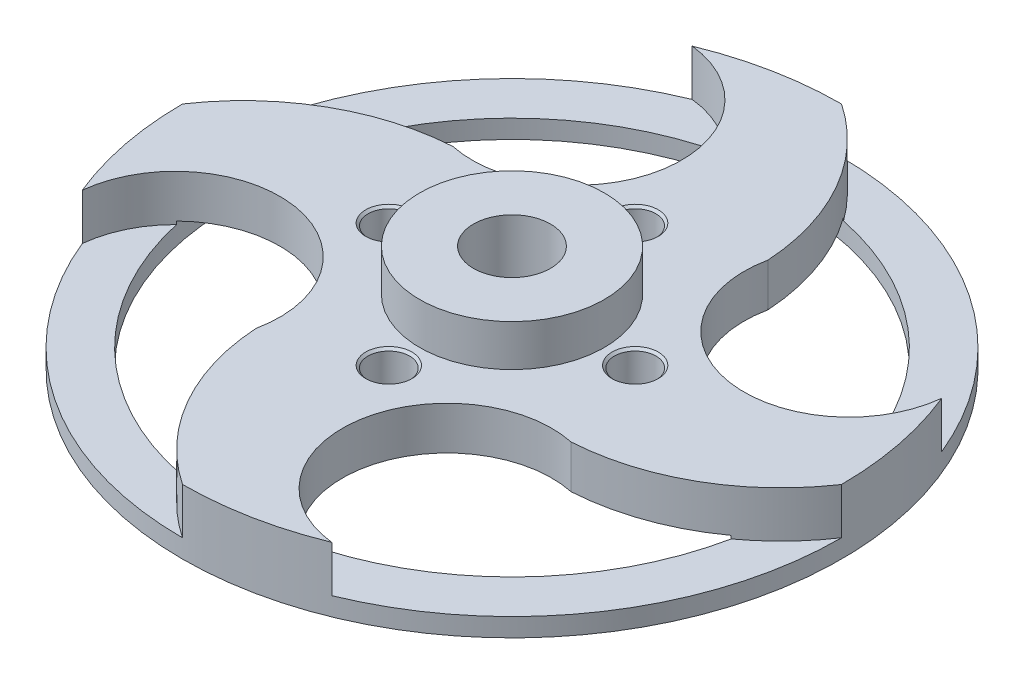
ISO-10303-21;
HEADER;
FILE_DESCRIPTION(('STEP AP214'),'2;1');
FILE_NAME('part.step','',(''),(''),'','','');
FILE_SCHEMA(('AUTOMOTIVE_DESIGN { 1 0 10303 214 1 1 1 1 }'));
ENDSEC;
DATA;
#1=APPLICATION_CONTEXT('core data for automotive mechanical design processes');
#2=APPLICATION_PROTOCOL_DEFINITION('international standard','automotive_design',2000,#1);
#3=PRODUCT_CONTEXT('',#1,'mechanical');
#4=PRODUCT('Part','Part','',(#3));
#5=PRODUCT_RELATED_PRODUCT_CATEGORY('part','',(#4));
#6=PRODUCT_DEFINITION_FORMATION('','',#4);
#7=PRODUCT_DEFINITION_CONTEXT('part definition',#1,'design');
#8=PRODUCT_DEFINITION('design','',#6,#7);
#9=PRODUCT_DEFINITION_SHAPE('','',#8);
#10=(LENGTH_UNIT() NAMED_UNIT(*) SI_UNIT(.MILLI.,.METRE.));
#11=(NAMED_UNIT(*) PLANE_ANGLE_UNIT() SI_UNIT($,.RADIAN.));
#12=(NAMED_UNIT(*) SI_UNIT($,.STERADIAN.) SOLID_ANGLE_UNIT());
#13=UNCERTAINTY_MEASURE_WITH_UNIT(LENGTH_MEASURE(1.E-05),#10,'distance_accuracy_value','');
#14=(GEOMETRIC_REPRESENTATION_CONTEXT(3) GLOBAL_UNCERTAINTY_ASSIGNED_CONTEXT((#13)) GLOBAL_UNIT_ASSIGNED_CONTEXT((#10,
#11,#12)) REPRESENTATION_CONTEXT('',''));
#15=CARTESIAN_POINT('',(0.,0.,0.));
#16=DIRECTION('',(0.,0.,1.));
#17=DIRECTION('',(1.,0.,0.));
#18=AXIS2_PLACEMENT_3D('',#15,#16,#17);
#19=CARTESIAN_POINT('',(-4.674678694587,4.2,4.05228917172682));
#20=DIRECTION('',(0.,1.,0.));
#21=DIRECTION('',(0.,0.,1.));
#22=AXIS2_PLACEMENT_3D('',#19,#20,#21);
#23=PLANE('',#22);
#24=CARTESIAN_POINT('',(-7.99999999999977,4.2,2.27373675443232E-13));
#25=DIRECTION('',(0.,1.,0.));
#26=DIRECTION('',(0.,0.,1.));
#27=AXIS2_PLACEMENT_3D('',#24,#25,#26);
#28=CIRCLE('',#27,1.5);
#29=CARTESIAN_POINT('',(-7.99999999999977,4.2,1.50000000000023));
#30=VERTEX_POINT('',#29);
#31=EDGE_CURVE('E701',#30,#30,#28,.T.);
#32=ORIENTED_EDGE('',*,*,#31,.F.);
#33=EDGE_LOOP('',(#32));
#34=FACE_BOUND('',#33,.T.);
#35=CARTESIAN_POINT('',(0.,4.2,-8.));
#36=DIRECTION('',(0.,1.,0.));
#37=DIRECTION('',(0.,0.,1.));
#38=AXIS2_PLACEMENT_3D('',#35,#36,#37);
#39=CIRCLE('',#38,1.5);
#40=CARTESIAN_POINT('',(0.,4.2,-6.5));
#41=VERTEX_POINT('',#40);
#42=EDGE_CURVE('E325',#41,#41,#39,.T.);
#43=ORIENTED_EDGE('',*,*,#42,.F.);
#44=EDGE_LOOP('',(#43));
#45=FACE_BOUND('',#44,.T.);
#46=CARTESIAN_POINT('',(8.00000000000023,4.2,-2.26393958003914E-13));
#47=DIRECTION('',(0.,1.,0.));
#48=DIRECTION('',(0.,0.,1.));
#49=AXIS2_PLACEMENT_3D('',#46,#47,#48);
#50=CIRCLE('',#49,1.5);
#51=CARTESIAN_POINT('',(8.00000000000023,4.2,1.49999999999977));
#52=VERTEX_POINT('',#51);
#53=EDGE_CURVE('E318',#52,#52,#50,.T.);
#54=ORIENTED_EDGE('',*,*,#53,.F.);
#55=EDGE_LOOP('',(#54));
#56=FACE_BOUND('',#55,.T.);
#57=CARTESIAN_POINT('',(4.52787916007828E-13,4.2,8.));
#58=DIRECTION('',(0.,1.,0.));
#59=DIRECTION('',(0.,0.,1.));
#60=AXIS2_PLACEMENT_3D('',#57,#58,#59);
#61=CIRCLE('',#60,1.5);
#62=CARTESIAN_POINT('',(4.52787916007828E-13,4.2,9.5));
#63=VERTEX_POINT('',#62);
#64=EDGE_CURVE('E314',#63,#63,#61,.T.);
#65=ORIENTED_EDGE('',*,*,#64,.F.);
#66=EDGE_LOOP('',(#65));
#67=FACE_BOUND('',#66,.T.);
#68=CARTESIAN_POINT('',(-9.34935738917399,4.2,8.10457834345364));
#69=DIRECTION('',(0.,1.,0.));
#70=DIRECTION('',(0.,0.,1.));
#71=AXIS2_PLACEMENT_3D('',#68,#69,#70);
#72=CIRCLE('',#71,14.5224714652511);
#73=CARTESIAN_POINT('',(-10.2293630007753,4.2,-6.39120613282027));
#74=VERTEX_POINT('',#73);
#75=CARTESIAN_POINT('',(-21.3999999999999,4.2,0.));
#76=VERTEX_POINT('',#75);
#77=EDGE_CURVE('E213',#74,#76,#72,.T.);
#78=ORIENTED_EDGE('',*,*,#77,.T.);
#79=CARTESIAN_POINT('',(0.,4.2,0.));
#80=DIRECTION('',(0.,1.,0.));
#81=DIRECTION('',(0.,0.,1.));
#82=AXIS2_PLACEMENT_3D('',#79,#80,#81);
#83=CIRCLE('',#82,21.3999999999999);
#84=CARTESIAN_POINT('',(-19.8066651088152,4.2,8.10284007414914));
#85=VERTEX_POINT('',#84);
#86=EDGE_CURVE('E216',#76,#85,#83,.T.);
#87=ORIENTED_EDGE('',*,*,#86,.T.);
#88=CARTESIAN_POINT('',(-13.0456505625838,4.2,8.82994550367591));
#89=DIRECTION('',(0.,1.,0.));
#90=DIRECTION('',(0.,0.,1.));
#91=AXIS2_PLACEMENT_3D('',#88,#89,#90);
#92=CIRCLE('',#91,6.8);
#93=CARTESIAN_POINT('',(-6.39120613282025,4.2,10.2293630007753));
#94=VERTEX_POINT('',#93);
#95=EDGE_CURVE('E218',#94,#85,#92,.T.);
#96=ORIENTED_EDGE('',*,*,#95,.F.);
#97=CARTESIAN_POINT('',(8.10457834345376,4.2,9.34935738917391));
#98=DIRECTION('',(0.,1.,0.));
#99=DIRECTION('',(0.,0.,1.));
#100=AXIS2_PLACEMENT_3D('',#97,#98,#99);
#101=CIRCLE('',#100,14.5224714652512);
#102=CARTESIAN_POINT('',(-1.52056145452661E-13,4.2,21.3999999999999));
#103=VERTEX_POINT('',#102);
#104=EDGE_CURVE('E221',#94,#103,#101,.T.);
#105=ORIENTED_EDGE('',*,*,#104,.T.);
#106=CARTESIAN_POINT('',(0.,4.2,0.));
#107=DIRECTION('',(0.,1.,0.));
#108=DIRECTION('',(0.,0.,1.));
#109=AXIS2_PLACEMENT_3D('',#106,#107,#108);
#110=CIRCLE('',#109,21.3999999999999);
#111=CARTESIAN_POINT('',(8.10284007414926,4.2,19.8066651088151));
#112=VERTEX_POINT('',#111);
#113=EDGE_CURVE('E223',#103,#112,#110,.T.);
#114=ORIENTED_EDGE('',*,*,#113,.T.);
#115=CARTESIAN_POINT('',(8.82994550367604,4.2,13.0456505625837));
#116=DIRECTION('',(0.,1.,0.));
#117=DIRECTION('',(0.,0.,1.));
#118=AXIS2_PLACEMENT_3D('',#115,#116,#117);
#119=CIRCLE('',#118,6.8);
#120=CARTESIAN_POINT('',(10.2293630007754,4.2,6.39120613282012));
#121=VERTEX_POINT('',#120);
#122=EDGE_CURVE('E225',#121,#112,#119,.T.);
#123=ORIENTED_EDGE('',*,*,#122,.F.);
#124=CARTESIAN_POINT('',(9.34935738917403,4.2,-8.10457834345385));
#125=DIRECTION('',(0.,1.,0.));
#126=DIRECTION('',(0.,0.,1.));
#127=AXIS2_PLACEMENT_3D('',#124,#125,#126);
#128=CIRCLE('',#127,14.5224714652512);
#129=CARTESIAN_POINT('',(21.4,4.2,0.));
#130=VERTEX_POINT('',#129);
#131=EDGE_CURVE('E228',#121,#130,#128,.T.);
#132=ORIENTED_EDGE('',*,*,#131,.T.);
#133=CARTESIAN_POINT('',(0.,4.2,0.));
#134=DIRECTION('',(0.,1.,0.));
#135=DIRECTION('',(0.,0.,1.));
#136=AXIS2_PLACEMENT_3D('',#133,#134,#135);
#137=CIRCLE('',#136,21.4);
#138=CARTESIAN_POINT('',(19.8066651088152,4.2,-8.10284007414934));
#139=VERTEX_POINT('',#138);
#140=EDGE_CURVE('E230',#130,#139,#137,.T.);
#141=ORIENTED_EDGE('',*,*,#140,.T.);
#142=CARTESIAN_POINT('',(13.0456505625838,4.2,-8.82994550367612));
#143=DIRECTION('',(0.,1.,0.));
#144=DIRECTION('',(0.,0.,1.));
#145=AXIS2_PLACEMENT_3D('',#142,#143,#144);
#146=CIRCLE('',#145,6.8);
#147=CARTESIAN_POINT('',(6.39120613282015,4.2,-10.2293630007755));
#148=VERTEX_POINT('',#147);
#149=EDGE_CURVE('E232',#148,#139,#146,.T.);
#150=ORIENTED_EDGE('',*,*,#149,.F.);
#151=CARTESIAN_POINT('',(-8.10457834345372,4.2,-9.34935738917412));
#152=DIRECTION('',(0.,1.,0.));
#153=DIRECTION('',(0.,0.,1.));
#154=AXIS2_PLACEMENT_3D('',#151,#152,#153);
#155=CIRCLE('',#154,14.5224714652511);
#156=CARTESIAN_POINT('',(0.,4.2,-21.4));
#157=VERTEX_POINT('',#156);
#158=EDGE_CURVE('E235',#148,#157,#155,.T.);
#159=ORIENTED_EDGE('',*,*,#158,.T.);
#160=CARTESIAN_POINT('',(0.,4.2,0.));
#161=DIRECTION('',(0.,1.,0.));
#162=DIRECTION('',(0.,0.,1.));
#163=AXIS2_PLACEMENT_3D('',#160,#161,#162);
#164=CIRCLE('',#163,21.4);
#165=CARTESIAN_POINT('',(-8.10284007414922,4.2,-19.8066651088153));
#166=VERTEX_POINT('',#165);
#167=EDGE_CURVE('E237',#157,#166,#164,.T.);
#168=ORIENTED_EDGE('',*,*,#167,.T.);
#169=CARTESIAN_POINT('',(-8.829945503676,4.2,-13.0456505625839));
#170=DIRECTION('',(0.,1.,0.));
#171=DIRECTION('',(0.,0.,1.));
#172=AXIS2_PLACEMENT_3D('',#169,#170,#171);
#173=CIRCLE('',#172,6.8);
#174=EDGE_CURVE('E239',#74,#166,#173,.T.);
#175=ORIENTED_EDGE('',*,*,#174,.F.);
#176=EDGE_LOOP('',(#78,#87,#96,#105,#114,#123,#132,#141,#150,#159,#168,#175));
#177=FACE_BOUND('',#176,.T.);
#178=CARTESIAN_POINT('',(0.,4.2,0.));
#179=DIRECTION('',(0.,1.,0.));
#180=DIRECTION('',(0.,0.,1.));
#181=AXIS2_PLACEMENT_3D('',#178,#179,#180);
#182=CIRCLE('',#181,6.);
#183=CARTESIAN_POINT('',(0.,4.2,-6.));
#184=VERTEX_POINT('',#183);
#185=EDGE_CURVE('E344',#184,#184,#182,.T.);
#186=ORIENTED_EDGE('',*,*,#185,.F.);
#187=EDGE_LOOP('',(#186));
#188=FACE_BOUND('',#187,.T.);
#189=ADVANCED_FACE('F35',(#34,#45,#56,#67,#177,#188),#23,.T.);
#190=CARTESIAN_POINT('',(0.,1.2,0.));
#191=DIRECTION('',(0.,1.,0.));
#192=DIRECTION('',(0.,0.,1.));
#193=AXIS2_PLACEMENT_3D('',#190,#191,#192);
#194=PLANE('',#193);
#195=CARTESIAN_POINT('',(0.,1.2,0.));
#196=DIRECTION('',(0.,1.,0.));
#197=DIRECTION('',(0.,0.,1.));
#198=AXIS2_PLACEMENT_3D('',#195,#196,#197);
#199=CIRCLE('',#198,18.25);
#200=CARTESIAN_POINT('',(-17.8109574433167,1.2,3.97898164765316));
#201=VERTEX_POINT('',#200);
#202=CARTESIAN_POINT('',(-3.64692600239005,1.2,17.8819023242241));
#203=VERTEX_POINT('',#202);
#204=EDGE_CURVE('E209',#201,#203,#199,.T.);
#205=ORIENTED_EDGE('',*,*,#204,.F.);
#206=CARTESIAN_POINT('',(-13.0456505625838,1.2,8.82994550367591));
#207=DIRECTION('',(0.,1.,0.));
#208=DIRECTION('',(0.,0.,1.));
#209=AXIS2_PLACEMENT_3D('',#206,#207,#208);
#210=CIRCLE('',#209,6.8);
#211=CARTESIAN_POINT('',(-19.8066651088152,1.2,8.10284007414943));
#212=VERTEX_POINT('',#211);
#213=EDGE_CURVE('E292',#212,#201,#210,.F.);
#214=ORIENTED_EDGE('',*,*,#213,.F.);
#215=CARTESIAN_POINT('',(0.,1.2,0.));
#216=DIRECTION('',(0.,1.,0.));
#217=DIRECTION('',(0.,0.,1.));
#218=AXIS2_PLACEMENT_3D('',#215,#216,#217);
#219=CIRCLE('',#218,21.4);
#220=CARTESIAN_POINT('',(0.,1.2,21.4));
#221=VERTEX_POINT('',#220);
#222=EDGE_CURVE('E299',#212,#221,#219,.T.);
#223=ORIENTED_EDGE('',*,*,#222,.T.);
#224=CARTESIAN_POINT('',(8.10457834345376,1.2,9.34935738917391));
#225=DIRECTION('',(0.,1.,0.));
#226=DIRECTION('',(0.,0.,1.));
#227=AXIS2_PLACEMENT_3D('',#224,#225,#226);
#228=CIRCLE('',#227,14.5224714652512);
#229=EDGE_CURVE('E289',#221,#203,#228,.F.);
#230=ORIENTED_EDGE('',*,*,#229,.T.);
#231=EDGE_LOOP('',(#205,#214,#223,#230));
#232=FACE_BOUND('',#231,.T.);
#233=ADVANCED_FACE('F428',(#232),#194,.T.);
#234=CARTESIAN_POINT('',(0.,1.2,0.));
#235=DIRECTION('',(0.,1.,0.));
#236=DIRECTION('',(0.,0.,1.));
#237=AXIS2_PLACEMENT_3D('',#234,#235,#236);
#238=CIRCLE('',#237,18.25);
#239=CARTESIAN_POINT('',(3.97898164765333,1.2,17.8109574433167));
#240=VERTEX_POINT('',#239);
#241=CARTESIAN_POINT('',(17.8819023242241,1.2,3.64692600238998));
#242=VERTEX_POINT('',#241);
#243=EDGE_CURVE('E197',#240,#242,#238,.T.);
#244=ORIENTED_EDGE('',*,*,#243,.F.);
#245=CARTESIAN_POINT('',(8.82994550367604,1.2,13.0456505625837));
#246=DIRECTION('',(0.,1.,0.));
#247=DIRECTION('',(0.,0.,1.));
#248=AXIS2_PLACEMENT_3D('',#245,#246,#247);
#249=CIRCLE('',#248,6.8);
#250=CARTESIAN_POINT('',(8.10284007414963,1.2,19.8066651088151));
#251=VERTEX_POINT('',#250);
#252=EDGE_CURVE('E286',#251,#240,#249,.F.);
#253=ORIENTED_EDGE('',*,*,#252,.F.);
#254=CARTESIAN_POINT('',(21.4,1.2,0.));
#255=VERTEX_POINT('',#254);
#256=EDGE_CURVE('E302',#251,#255,#219,.T.);
#257=ORIENTED_EDGE('',*,*,#256,.T.);
#258=CARTESIAN_POINT('',(9.34935738917403,1.2,-8.10457834345385));
#259=DIRECTION('',(0.,1.,0.));
#260=DIRECTION('',(0.,0.,1.));
#261=AXIS2_PLACEMENT_3D('',#258,#259,#260);
#262=CIRCLE('',#261,14.5224714652512);
#263=EDGE_CURVE('E283',#255,#242,#262,.F.);
#264=ORIENTED_EDGE('',*,*,#263,.T.);
#265=EDGE_LOOP('',(#244,#253,#257,#264));
#266=FACE_BOUND('',#265,.T.);
#267=ADVANCED_FACE('F415',(#266),#194,.T.);
#268=CARTESIAN_POINT('',(0.,1.2,0.));
#269=DIRECTION('',(0.,1.,0.));
#270=DIRECTION('',(0.,0.,1.));
#271=AXIS2_PLACEMENT_3D('',#268,#269,#270);
#272=CIRCLE('',#271,18.25);
#273=CARTESIAN_POINT('',(-3.97898164765312,1.2,-17.8109574433167));
#274=VERTEX_POINT('',#273);
#275=CARTESIAN_POINT('',(-17.8819023242241,1.2,-3.64692600239006));
#276=VERTEX_POINT('',#275);
#277=EDGE_CURVE('E365',#274,#276,#272,.T.);
#278=ORIENTED_EDGE('',*,*,#277,.F.);
#279=CARTESIAN_POINT('',(-8.829945503676,1.2,-13.0456505625839));
#280=DIRECTION('',(0.,1.,0.));
#281=DIRECTION('',(0.,0.,1.));
#282=AXIS2_PLACEMENT_3D('',#279,#280,#281);
#283=CIRCLE('',#282,6.8);
#284=CARTESIAN_POINT('',(-8.10284007414921,1.2,-19.8066651088153));
#285=VERTEX_POINT('',#284);
#286=EDGE_CURVE('E276',#285,#274,#283,.F.);
#287=ORIENTED_EDGE('',*,*,#286,.F.);
#288=CARTESIAN_POINT('',(-21.4,1.2,0.));
#289=VERTEX_POINT('',#288);
#290=EDGE_CURVE('E301',#285,#289,#219,.T.);
#291=ORIENTED_EDGE('',*,*,#290,.T.);
#292=CARTESIAN_POINT('',(-9.34935738917399,1.2,8.10457834345364));
#293=DIRECTION('',(0.,1.,0.));
#294=DIRECTION('',(0.,0.,1.));
#295=AXIS2_PLACEMENT_3D('',#292,#293,#294);
#296=CIRCLE('',#295,14.5224714652511);
#297=EDGE_CURVE('E295',#289,#276,#296,.F.);
#298=ORIENTED_EDGE('',*,*,#297,.T.);
#299=EDGE_LOOP('',(#278,#287,#291,#298));
#300=FACE_BOUND('',#299,.T.);
#301=ADVANCED_FACE('F386',(#300),#194,.T.);
#302=CARTESIAN_POINT('',(0.,1.2,0.));
#303=DIRECTION('',(0.,-1.,0.));
#304=DIRECTION('',(0.,0.,-1.));
#305=AXIS2_PLACEMENT_3D('',#302,#303,#304);
#306=CYLINDRICAL_SURFACE('',#305,21.4);
#307=CARTESIAN_POINT('',(0.,0.,0.));
#308=DIRECTION('',(0.,1.,0.));
#309=DIRECTION('',(0.,0.,1.));
#310=AXIS2_PLACEMENT_3D('',#307,#308,#309);
#311=CIRCLE('',#310,21.4);
#312=CARTESIAN_POINT('',(0.,0.,21.4));
#313=VERTEX_POINT('',#312);
#314=EDGE_CURVE('E298',#313,#313,#311,.T.);
#315=ORIENTED_EDGE('',*,*,#314,.T.);
#316=EDGE_LOOP('',(#315));
#317=FACE_BOUND('',#316,.T.);
#318=DIRECTION('',(0.,-1.,0.));
#319=VECTOR('',#318,1.);
#320=CARTESIAN_POINT('',(-21.3999999999999,4.2,0.));
#321=LINE('',#320,#319);
#322=EDGE_CURVE('E273',#76,#289,#321,.T.);
#323=ORIENTED_EDGE('',*,*,#322,.T.);
#324=ORIENTED_EDGE('',*,*,#290,.F.);
#325=DIRECTION('',(0.,-1.,0.));
#326=VECTOR('',#325,1.);
#327=CARTESIAN_POINT('',(-8.10284007414922,4.2,-19.8066651088153));
#328=LINE('',#327,#326);
#329=EDGE_CURVE('E245',#166,#285,#328,.T.);
#330=ORIENTED_EDGE('',*,*,#329,.F.);
#331=ORIENTED_EDGE('',*,*,#167,.F.);
#332=DIRECTION('',(0.,-1.,0.));
#333=VECTOR('',#332,1.);
#334=CARTESIAN_POINT('',(0.,4.2,-21.4));
#335=LINE('',#334,#333);
#336=CARTESIAN_POINT('',(0.,1.2,-21.4));
#337=VERTEX_POINT('',#336);
#338=EDGE_CURVE('E248',#157,#337,#335,.T.);
#339=ORIENTED_EDGE('',*,*,#338,.T.);
#340=CARTESIAN_POINT('',(19.8066651088152,1.2,-8.10284007414941));
#341=VERTEX_POINT('',#340);
#342=EDGE_CURVE('E379',#341,#337,#219,.T.);
#343=ORIENTED_EDGE('',*,*,#342,.F.);
#344=DIRECTION('',(0.,-1.,0.));
#345=VECTOR('',#344,1.);
#346=CARTESIAN_POINT('',(19.8066651088152,4.2,-8.10284007414934));
#347=LINE('',#346,#345);
#348=EDGE_CURVE('E253',#139,#341,#347,.T.);
#349=ORIENTED_EDGE('',*,*,#348,.F.);
#350=ORIENTED_EDGE('',*,*,#140,.F.);
#351=DIRECTION('',(0.,-1.,0.));
#352=VECTOR('',#351,1.);
#353=CARTESIAN_POINT('',(21.4,4.2,0.));
#354=LINE('',#353,#352);
#355=EDGE_CURVE('E255',#130,#255,#354,.T.);
#356=ORIENTED_EDGE('',*,*,#355,.T.);
#357=ORIENTED_EDGE('',*,*,#256,.F.);
#358=DIRECTION('',(0.,-1.,0.));
#359=VECTOR('',#358,1.);
#360=CARTESIAN_POINT('',(8.10284007414926,4.2,19.8066651088151));
#361=LINE('',#360,#359);
#362=EDGE_CURVE('E261',#112,#251,#361,.T.);
#363=ORIENTED_EDGE('',*,*,#362,.F.);
#364=ORIENTED_EDGE('',*,*,#113,.F.);
#365=DIRECTION('',(0.,-1.,0.));
#366=VECTOR('',#365,1.);
#367=CARTESIAN_POINT('',(-1.52056145452661E-13,4.2,21.3999999999999));
#368=LINE('',#367,#366);
#369=EDGE_CURVE('E264',#103,#221,#368,.T.);
#370=ORIENTED_EDGE('',*,*,#369,.T.);
#371=ORIENTED_EDGE('',*,*,#222,.F.);
#372=DIRECTION('',(0.,-1.,0.));
#373=VECTOR('',#372,1.);
#374=CARTESIAN_POINT('',(-19.8066651088152,4.2,8.10284007414914));
#375=LINE('',#374,#373);
#376=EDGE_CURVE('E270',#85,#212,#375,.T.);
#377=ORIENTED_EDGE('',*,*,#376,.F.);
#378=ORIENTED_EDGE('',*,*,#86,.F.);
#379=EDGE_LOOP('',(#323,#324,#330,#331,#339,#343,#349,#350,#356,#357,#363,#364,#370,#371,#377,#378));
#380=FACE_BOUND('',#379,.T.);
#381=ADVANCED_FACE('F37',(#317,#380),#306,.T.);
#382=CARTESIAN_POINT('',(0.,1.2,0.));
#383=DIRECTION('',(0.,1.,0.));
#384=DIRECTION('',(0.,0.,1.));
#385=AXIS2_PLACEMENT_3D('',#382,#383,#384);
#386=CIRCLE('',#385,18.25);
#387=CARTESIAN_POINT('',(17.8109574433167,1.2,-3.97898164765329));
#388=VERTEX_POINT('',#387);
#389=CARTESIAN_POINT('',(3.64692600239006,1.2,-17.8819023242241));
#390=VERTEX_POINT('',#389);
#391=EDGE_CURVE('E195',#388,#390,#386,.T.);
#392=ORIENTED_EDGE('',*,*,#391,.F.);
#393=CARTESIAN_POINT('',(13.0456505625838,1.2,-8.82994550367612));
#394=DIRECTION('',(0.,1.,0.));
#395=DIRECTION('',(0.,0.,1.));
#396=AXIS2_PLACEMENT_3D('',#393,#394,#395);
#397=CIRCLE('',#396,6.8);
#398=EDGE_CURVE('E194',#341,#388,#397,.F.);
#399=ORIENTED_EDGE('',*,*,#398,.F.);
#400=ORIENTED_EDGE('',*,*,#342,.T.);
#401=CARTESIAN_POINT('',(-8.10457834345372,1.2,-9.34935738917412));
#402=DIRECTION('',(0.,1.,0.));
#403=DIRECTION('',(0.,0.,1.));
#404=AXIS2_PLACEMENT_3D('',#401,#402,#403);
#405=CIRCLE('',#404,14.5224714652511);
#406=EDGE_CURVE('E279',#337,#390,#405,.F.);
#407=ORIENTED_EDGE('',*,*,#406,.T.);
#408=EDGE_LOOP('',(#392,#399,#400,#407));
#409=FACE_BOUND('',#408,.T.);
#410=ADVANCED_FACE('F377',(#409),#194,.T.);
#411=CARTESIAN_POINT('',(0.,0.,0.));
#412=DIRECTION('',(0.,1.,0.));
#413=DIRECTION('',(0.,0.,1.));
#414=AXIS2_PLACEMENT_3D('',#411,#412,#413);
#415=PLANE('',#414);
#416=CARTESIAN_POINT('',(0.,0.,0.));
#417=DIRECTION('',(0.,-1.,0.));
#418=DIRECTION('',(0.,0.,-1.));
#419=AXIS2_PLACEMENT_3D('',#416,#417,#418);
#420=CIRCLE('',#419,18.25);
#421=CARTESIAN_POINT('',(0.,0.,-18.25));
#422=VERTEX_POINT('',#421);
#423=EDGE_CURVE('E348',#422,#422,#420,.T.);
#424=ORIENTED_EDGE('',*,*,#423,.F.);
#425=EDGE_LOOP('',(#424));
#426=FACE_BOUND('',#425,.T.);
#427=ORIENTED_EDGE('',*,*,#314,.F.);
#428=EDGE_LOOP('',(#427));
#429=FACE_BOUND('',#428,.T.);
#430=ADVANCED_FACE('F634',(#426,#429),#415,.F.);
#431=CARTESIAN_POINT('',(-9.34935738917399,4.2,8.10457834345364));
#432=DIRECTION('',(0.,-1.,0.));
#433=DIRECTION('',(0.,0.,-1.));
#434=AXIS2_PLACEMENT_3D('',#431,#432,#433);
#435=CYLINDRICAL_SURFACE('',#434,14.5224714652511);
#436=CARTESIAN_POINT('',(-9.34935738917399,1.4,8.10457834345364));
#437=DIRECTION('',(0.,-1.,0.));
#438=DIRECTION('',(0.,0.,-1.));
#439=AXIS2_PLACEMENT_3D('',#436,#437,#438);
#440=CIRCLE('',#439,14.5224714652511);
#441=CARTESIAN_POINT('',(-17.8819023242241,1.4,-3.64692600239006));
#442=VERTEX_POINT('',#441);
#443=CARTESIAN_POINT('',(-10.2293630007753,1.4,-6.39120613282027));
#444=VERTEX_POINT('',#443);
#445=EDGE_CURVE('E188',#442,#444,#440,.T.);
#446=ORIENTED_EDGE('',*,*,#445,.F.);
#447=DIRECTION('',(0.,-1.,0.));
#448=VECTOR('',#447,1.);
#449=CARTESIAN_POINT('',(-17.8819023242241,0.7,-3.64692600239006));
#450=LINE('',#449,#448);
#451=EDGE_CURVE('E367',#442,#276,#450,.T.);
#452=ORIENTED_EDGE('',*,*,#451,.T.);
#453=ORIENTED_EDGE('',*,*,#297,.F.);
#454=ORIENTED_EDGE('',*,*,#322,.F.);
#455=ORIENTED_EDGE('',*,*,#77,.F.);
#456=DIRECTION('',(0.,-1.,0.));
#457=VECTOR('',#456,1.);
#458=CARTESIAN_POINT('',(-10.2293630007753,4.2,-6.39120613282027));
#459=LINE('',#458,#457);
#460=EDGE_CURVE('E242',#74,#444,#459,.T.);
#461=ORIENTED_EDGE('',*,*,#460,.T.);
#462=EDGE_LOOP('',(#446,#452,#453,#454,#455,#461));
#463=FACE_BOUND('',#462,.T.);
#464=ADVANCED_FACE('F391',(#463),#435,.T.);
#465=CARTESIAN_POINT('',(-13.0456505625838,4.2,8.82994550367591));
#466=DIRECTION('',(0.,-1.,0.));
#467=DIRECTION('',(0.,0.,-1.));
#468=AXIS2_PLACEMENT_3D('',#465,#466,#467);
#469=CYLINDRICAL_SURFACE('',#468,6.8);
#470=DIRECTION('',(0.,-1.,0.));
#471=VECTOR('',#470,1.);
#472=CARTESIAN_POINT('',(-17.8109574433167,0.7,3.97898164765316));
#473=LINE('',#472,#471);
#474=CARTESIAN_POINT('',(-17.8109574433167,1.4,3.97898164765315));
#475=VERTEX_POINT('',#474);
#476=EDGE_CURVE('E211',#475,#201,#473,.T.);
#477=ORIENTED_EDGE('',*,*,#476,.F.);
#478=CARTESIAN_POINT('',(-13.0456505625838,1.4,8.82994550367591));
#479=DIRECTION('',(0.,-1.,0.));
#480=DIRECTION('',(0.,0.,-1.));
#481=AXIS2_PLACEMENT_3D('',#478,#479,#480);
#482=CIRCLE('',#481,6.8);
#483=CARTESIAN_POINT('',(-6.39120613282025,1.4,10.2293630007753));
#484=VERTEX_POINT('',#483);
#485=EDGE_CURVE('E362',#475,#484,#482,.T.);
#486=ORIENTED_EDGE('',*,*,#485,.T.);
#487=DIRECTION('',(0.,-1.,0.));
#488=VECTOR('',#487,1.);
#489=CARTESIAN_POINT('',(-6.39120613282025,4.2,10.2293630007753));
#490=LINE('',#489,#488);
#491=EDGE_CURVE('E267',#94,#484,#490,.T.);
#492=ORIENTED_EDGE('',*,*,#491,.F.);
#493=ORIENTED_EDGE('',*,*,#95,.T.);
#494=ORIENTED_EDGE('',*,*,#376,.T.);
#495=ORIENTED_EDGE('',*,*,#213,.T.);
#496=EDGE_LOOP('',(#477,#486,#492,#493,#494,#495));
#497=FACE_BOUND('',#496,.T.);
#498=ADVANCED_FACE('F426',(#497),#469,.F.);
#499=CARTESIAN_POINT('',(8.10457834345376,4.2,9.34935738917391));
#500=DIRECTION('',(0.,-1.,0.));
#501=DIRECTION('',(0.,0.,-1.));
#502=AXIS2_PLACEMENT_3D('',#499,#500,#501);
#503=CYLINDRICAL_SURFACE('',#502,14.5224714652512);
#504=CARTESIAN_POINT('',(8.10457834345376,1.4,9.34935738917391));
#505=DIRECTION('',(0.,-1.,0.));
#506=DIRECTION('',(0.,0.,-1.));
#507=AXIS2_PLACEMENT_3D('',#504,#505,#506);
#508=CIRCLE('',#507,14.5224714652512);
#509=CARTESIAN_POINT('',(-3.64692600239004,1.4,17.8819023242241));
#510=VERTEX_POINT('',#509);
#511=EDGE_CURVE('E360',#510,#484,#508,.T.);
#512=ORIENTED_EDGE('',*,*,#511,.F.);
#513=DIRECTION('',(0.,-1.,0.));
#514=VECTOR('',#513,1.);
#515=CARTESIAN_POINT('',(-3.64692600239004,0.7,17.8819023242241));
#516=LINE('',#515,#514);
#517=EDGE_CURVE('E206',#510,#203,#516,.T.);
#518=ORIENTED_EDGE('',*,*,#517,.T.);
#519=ORIENTED_EDGE('',*,*,#229,.F.);
#520=ORIENTED_EDGE('',*,*,#369,.F.);
#521=ORIENTED_EDGE('',*,*,#104,.F.);
#522=ORIENTED_EDGE('',*,*,#491,.T.);
#523=EDGE_LOOP('',(#512,#518,#519,#520,#521,#522));
#524=FACE_BOUND('',#523,.T.);
#525=ADVANCED_FACE('F433',(#524),#503,.T.);
#526=CARTESIAN_POINT('',(8.82994550367604,4.2,13.0456505625837));
#527=DIRECTION('',(0.,-1.,0.));
#528=DIRECTION('',(0.,0.,-1.));
#529=AXIS2_PLACEMENT_3D('',#526,#527,#528);
#530=CYLINDRICAL_SURFACE('',#529,6.8);
#531=DIRECTION('',(0.,-1.,0.));
#532=VECTOR('',#531,1.);
#533=CARTESIAN_POINT('',(3.97898164765333,0.7,17.8109574433167));
#534=LINE('',#533,#532);
#535=CARTESIAN_POINT('',(3.97898164765332,1.4,17.8109574433167));
#536=VERTEX_POINT('',#535);
#537=EDGE_CURVE('E204',#536,#240,#534,.T.);
#538=ORIENTED_EDGE('',*,*,#537,.F.);
#539=CARTESIAN_POINT('',(8.82994550367604,1.4,13.0456505625837));
#540=DIRECTION('',(0.,-1.,0.));
#541=DIRECTION('',(0.,0.,-1.));
#542=AXIS2_PLACEMENT_3D('',#539,#540,#541);
#543=CIRCLE('',#542,6.8);
#544=CARTESIAN_POINT('',(10.2293630007754,1.4,6.39120613282012));
#545=VERTEX_POINT('',#544);
#546=EDGE_CURVE('E357',#536,#545,#543,.T.);
#547=ORIENTED_EDGE('',*,*,#546,.T.);
#548=DIRECTION('',(0.,-1.,0.));
#549=VECTOR('',#548,1.);
#550=CARTESIAN_POINT('',(10.2293630007754,4.2,6.39120613282012));
#551=LINE('',#550,#549);
#552=EDGE_CURVE('E258',#121,#545,#551,.T.);
#553=ORIENTED_EDGE('',*,*,#552,.F.);
#554=ORIENTED_EDGE('',*,*,#122,.T.);
#555=ORIENTED_EDGE('',*,*,#362,.T.);
#556=ORIENTED_EDGE('',*,*,#252,.T.);
#557=EDGE_LOOP('',(#538,#547,#553,#554,#555,#556));
#558=FACE_BOUND('',#557,.T.);
#559=ADVANCED_FACE('F420',(#558),#530,.F.);
#560=CARTESIAN_POINT('',(9.34935738917403,4.2,-8.10457834345385));
#561=DIRECTION('',(0.,-1.,0.));
#562=DIRECTION('',(0.,0.,-1.));
#563=AXIS2_PLACEMENT_3D('',#560,#561,#562);
#564=CYLINDRICAL_SURFACE('',#563,14.5224714652512);
#565=CARTESIAN_POINT('',(9.34935738917403,1.4,-8.10457834345385));
#566=DIRECTION('',(0.,-1.,0.));
#567=DIRECTION('',(0.,0.,-1.));
#568=AXIS2_PLACEMENT_3D('',#565,#566,#567);
#569=CIRCLE('',#568,14.5224714652512);
#570=CARTESIAN_POINT('',(17.8819023242241,1.4,3.64692600238998));
#571=VERTEX_POINT('',#570);
#572=EDGE_CURVE('E178',#571,#545,#569,.T.);
#573=ORIENTED_EDGE('',*,*,#572,.F.);
#574=DIRECTION('',(0.,-1.,0.));
#575=VECTOR('',#574,1.);
#576=CARTESIAN_POINT('',(17.8819023242241,0.7,3.64692600238997));
#577=LINE('',#576,#575);
#578=EDGE_CURVE('E186',#571,#242,#577,.T.);
#579=ORIENTED_EDGE('',*,*,#578,.T.);
#580=ORIENTED_EDGE('',*,*,#263,.F.);
#581=ORIENTED_EDGE('',*,*,#355,.F.);
#582=ORIENTED_EDGE('',*,*,#131,.F.);
#583=ORIENTED_EDGE('',*,*,#552,.T.);
#584=EDGE_LOOP('',(#573,#579,#580,#581,#582,#583));
#585=FACE_BOUND('',#584,.T.);
#586=ADVANCED_FACE('F412',(#585),#564,.T.);
#587=CARTESIAN_POINT('',(13.0456505625838,4.2,-8.82994550367612));
#588=DIRECTION('',(0.,-1.,0.));
#589=DIRECTION('',(0.,0.,-1.));
#590=AXIS2_PLACEMENT_3D('',#587,#588,#589);
#591=CYLINDRICAL_SURFACE('',#590,6.8);
#592=DIRECTION('',(0.,-1.,0.));
#593=VECTOR('',#592,1.);
#594=CARTESIAN_POINT('',(17.8109574433167,0.7,-3.97898164765329));
#595=LINE('',#594,#593);
#596=CARTESIAN_POINT('',(17.8109574433167,1.4,-3.97898164765328));
#597=VERTEX_POINT('',#596);
#598=EDGE_CURVE('E183',#597,#388,#595,.T.);
#599=ORIENTED_EDGE('',*,*,#598,.F.);
#600=CARTESIAN_POINT('',(13.0456505625838,1.4,-8.82994550367612));
#601=DIRECTION('',(0.,-1.,0.));
#602=DIRECTION('',(0.,0.,-1.));
#603=AXIS2_PLACEMENT_3D('',#600,#601,#602);
#604=CIRCLE('',#603,6.8);
#605=CARTESIAN_POINT('',(6.39120613282015,1.4,-10.2293630007755));
#606=VERTEX_POINT('',#605);
#607=EDGE_CURVE('E170',#597,#606,#604,.T.);
#608=ORIENTED_EDGE('',*,*,#607,.T.);
#609=DIRECTION('',(0.,-1.,0.));
#610=VECTOR('',#609,1.);
#611=CARTESIAN_POINT('',(6.39120613282015,4.2,-10.2293630007755));
#612=LINE('',#611,#610);
#613=EDGE_CURVE('E251',#148,#606,#612,.T.);
#614=ORIENTED_EDGE('',*,*,#613,.F.);
#615=ORIENTED_EDGE('',*,*,#149,.T.);
#616=ORIENTED_EDGE('',*,*,#348,.T.);
#617=ORIENTED_EDGE('',*,*,#398,.T.);
#618=EDGE_LOOP('',(#599,#608,#614,#615,#616,#617));
#619=FACE_BOUND('',#618,.T.);
#620=ADVANCED_FACE('F192',(#619),#591,.F.);
#621=CARTESIAN_POINT('',(-8.10457834345372,4.2,-9.34935738917412));
#622=DIRECTION('',(0.,-1.,0.));
#623=DIRECTION('',(0.,0.,-1.));
#624=AXIS2_PLACEMENT_3D('',#621,#622,#623);
#625=CYLINDRICAL_SURFACE('',#624,14.5224714652511);
#626=CARTESIAN_POINT('',(-8.10457834345372,1.4,-9.34935738917412));
#627=DIRECTION('',(0.,-1.,0.));
#628=DIRECTION('',(0.,0.,-1.));
#629=AXIS2_PLACEMENT_3D('',#626,#627,#628);
#630=CIRCLE('',#629,14.5224714652511);
#631=CARTESIAN_POINT('',(3.64692600239006,1.4,-17.8819023242241));
#632=VERTEX_POINT('',#631);
#633=EDGE_CURVE('E174',#632,#606,#630,.T.);
#634=ORIENTED_EDGE('',*,*,#633,.F.);
#635=DIRECTION('',(0.,-1.,0.));
#636=VECTOR('',#635,1.);
#637=CARTESIAN_POINT('',(3.64692600239006,0.7,-17.8819023242241));
#638=LINE('',#637,#636);
#639=EDGE_CURVE('E199',#632,#390,#638,.T.);
#640=ORIENTED_EDGE('',*,*,#639,.T.);
#641=ORIENTED_EDGE('',*,*,#406,.F.);
#642=ORIENTED_EDGE('',*,*,#338,.F.);
#643=ORIENTED_EDGE('',*,*,#158,.F.);
#644=ORIENTED_EDGE('',*,*,#613,.T.);
#645=EDGE_LOOP('',(#634,#640,#641,#642,#643,#644));
#646=FACE_BOUND('',#645,.T.);
#647=ADVANCED_FACE('F373',(#646),#625,.T.);
#648=CARTESIAN_POINT('',(-8.829945503676,4.2,-13.0456505625839));
#649=DIRECTION('',(0.,-1.,0.));
#650=DIRECTION('',(0.,0.,-1.));
#651=AXIS2_PLACEMENT_3D('',#648,#649,#650);
#652=CYLINDRICAL_SURFACE('',#651,6.8);
#653=DIRECTION('',(0.,-1.,0.));
#654=VECTOR('',#653,1.);
#655=CARTESIAN_POINT('',(-3.97898164765312,0.7,-17.8109574433167));
#656=LINE('',#655,#654);
#657=CARTESIAN_POINT('',(-3.97898164765311,1.4,-17.8109574433167));
#658=VERTEX_POINT('',#657);
#659=EDGE_CURVE('E11',#658,#274,#656,.T.);
#660=ORIENTED_EDGE('',*,*,#659,.F.);
#661=CARTESIAN_POINT('',(-8.829945503676,1.4,-13.0456505625839));
#662=DIRECTION('',(0.,-1.,0.));
#663=DIRECTION('',(0.,0.,-1.));
#664=AXIS2_PLACEMENT_3D('',#661,#662,#663);
#665=CIRCLE('',#664,6.8);
#666=EDGE_CURVE('E44',#658,#444,#665,.T.);
#667=ORIENTED_EDGE('',*,*,#666,.T.);
#668=ORIENTED_EDGE('',*,*,#460,.F.);
#669=ORIENTED_EDGE('',*,*,#174,.T.);
#670=ORIENTED_EDGE('',*,*,#329,.T.);
#671=ORIENTED_EDGE('',*,*,#286,.T.);
#672=EDGE_LOOP('',(#660,#667,#668,#669,#670,#671));
#673=FACE_BOUND('',#672,.T.);
#674=ADVANCED_FACE('F401',(#673),#652,.F.);
#675=CARTESIAN_POINT('',(0.,1.4,0.));
#676=DIRECTION('',(0.,-1.,0.));
#677=DIRECTION('',(0.,0.,-1.));
#678=AXIS2_PLACEMENT_3D('',#675,#676,#677);
#679=CYLINDRICAL_SURFACE('',#678,18.25);
#680=ORIENTED_EDGE('',*,*,#476,.T.);
#681=ORIENTED_EDGE('',*,*,#204,.T.);
#682=ORIENTED_EDGE('',*,*,#517,.F.);
#683=CARTESIAN_POINT('',(0.,1.4,0.));
#684=DIRECTION('',(0.,-1.,0.));
#685=DIRECTION('',(0.,0.,-1.));
#686=AXIS2_PLACEMENT_3D('',#683,#684,#685);
#687=CIRCLE('',#686,18.25);
#688=EDGE_CURVE('E52',#536,#510,#687,.T.);
#689=ORIENTED_EDGE('',*,*,#688,.F.);
#690=ORIENTED_EDGE('',*,*,#537,.T.);
#691=ORIENTED_EDGE('',*,*,#243,.T.);
#692=ORIENTED_EDGE('',*,*,#578,.F.);
#693=EDGE_CURVE('E59',#597,#571,#687,.T.);
#694=ORIENTED_EDGE('',*,*,#693,.F.);
#695=ORIENTED_EDGE('',*,*,#598,.T.);
#696=ORIENTED_EDGE('',*,*,#391,.T.);
#697=ORIENTED_EDGE('',*,*,#639,.F.);
#698=EDGE_CURVE('E190',#658,#632,#687,.T.);
#699=ORIENTED_EDGE('',*,*,#698,.F.);
#700=ORIENTED_EDGE('',*,*,#659,.T.);
#701=ORIENTED_EDGE('',*,*,#277,.T.);
#702=ORIENTED_EDGE('',*,*,#451,.F.);
#703=EDGE_CURVE('E351',#475,#442,#687,.T.);
#704=ORIENTED_EDGE('',*,*,#703,.F.);
#705=EDGE_LOOP('',(#680,#681,#682,#689,#690,#691,#692,#694,#695,#696,#697,#699,#700,#701,#702,#704));
#706=FACE_BOUND('',#705,.T.);
#707=ORIENTED_EDGE('',*,*,#423,.T.);
#708=EDGE_LOOP('',(#707));
#709=FACE_BOUND('',#708,.T.);
#710=ADVANCED_FACE('F181',(#706,#709),#679,.F.);
#711=CARTESIAN_POINT('',(0.,1.4,0.));
#712=DIRECTION('',(0.,-1.,0.));
#713=DIRECTION('',(0.,0.,-1.));
#714=AXIS2_PLACEMENT_3D('',#711,#712,#713);
#715=PLANE('',#714);
#716=CARTESIAN_POINT('',(-7.99999999999977,1.4,2.27373675443232E-13));
#717=DIRECTION('',(0.,-1.,0.));
#718=DIRECTION('',(0.,0.,-1.));
#719=AXIS2_PLACEMENT_3D('',#716,#717,#718);
#720=CIRCLE('',#719,1.35);
#721=CARTESIAN_POINT('',(-7.99999999999977,1.4,-1.34999999999977));
#722=VERTEX_POINT('',#721);
#723=EDGE_CURVE('E39',#722,#722,#720,.T.);
#724=ORIENTED_EDGE('',*,*,#723,.F.);
#725=EDGE_LOOP('',(#724));
#726=FACE_BOUND('',#725,.T.);
#727=CARTESIAN_POINT('',(0.,1.4,-8.));
#728=DIRECTION('',(0.,-1.,0.));
#729=DIRECTION('',(0.,0.,-1.));
#730=AXIS2_PLACEMENT_3D('',#727,#728,#729);
#731=CIRCLE('',#730,1.35);
#732=CARTESIAN_POINT('',(0.,1.4,-9.35));
#733=VERTEX_POINT('',#732);
#734=EDGE_CURVE('E316',#733,#733,#731,.T.);
#735=ORIENTED_EDGE('',*,*,#734,.F.);
#736=EDGE_LOOP('',(#735));
#737=FACE_BOUND('',#736,.T.);
#738=CARTESIAN_POINT('',(8.00000000000023,1.4,-2.26393958003914E-13));
#739=DIRECTION('',(0.,-1.,0.));
#740=DIRECTION('',(0.,0.,-1.));
#741=AXIS2_PLACEMENT_3D('',#738,#739,#740);
#742=CIRCLE('',#741,1.35);
#743=CARTESIAN_POINT('',(8.00000000000023,1.4,-1.35000000000023));
#744=VERTEX_POINT('',#743);
#745=EDGE_CURVE('E312',#744,#744,#742,.T.);
#746=ORIENTED_EDGE('',*,*,#745,.F.);
#747=EDGE_LOOP('',(#746));
#748=FACE_BOUND('',#747,.T.);
#749=CARTESIAN_POINT('',(4.52787916007828E-13,1.4,8.));
#750=DIRECTION('',(0.,-1.,0.));
#751=DIRECTION('',(0.,0.,-1.));
#752=AXIS2_PLACEMENT_3D('',#749,#750,#751);
#753=CIRCLE('',#752,1.35);
#754=CARTESIAN_POINT('',(4.52787916007828E-13,1.4,6.65));
#755=VERTEX_POINT('',#754);
#756=EDGE_CURVE('E307',#755,#755,#753,.T.);
#757=ORIENTED_EDGE('',*,*,#756,.F.);
#758=EDGE_LOOP('',(#757));
#759=FACE_BOUND('',#758,.T.);
#760=CARTESIAN_POINT('',(0.,1.4,0.));
#761=DIRECTION('',(0.,-1.,0.));
#762=DIRECTION('',(0.,0.,-1.));
#763=AXIS2_PLACEMENT_3D('',#760,#761,#762);
#764=CIRCLE('',#763,2.5);
#765=CARTESIAN_POINT('',(0.,1.4,2.5));
#766=VERTEX_POINT('',#765);
#767=EDGE_CURVE('E341',#766,#766,#764,.T.);
#768=ORIENTED_EDGE('',*,*,#767,.F.);
#769=EDGE_LOOP('',(#768));
#770=FACE_BOUND('',#769,.T.);
#771=ORIENTED_EDGE('',*,*,#703,.T.);
#772=ORIENTED_EDGE('',*,*,#445,.T.);
#773=ORIENTED_EDGE('',*,*,#666,.F.);
#774=ORIENTED_EDGE('',*,*,#698,.T.);
#775=ORIENTED_EDGE('',*,*,#633,.T.);
#776=ORIENTED_EDGE('',*,*,#607,.F.);
#777=ORIENTED_EDGE('',*,*,#693,.T.);
#778=ORIENTED_EDGE('',*,*,#572,.T.);
#779=ORIENTED_EDGE('',*,*,#546,.F.);
#780=ORIENTED_EDGE('',*,*,#688,.T.);
#781=ORIENTED_EDGE('',*,*,#511,.T.);
#782=ORIENTED_EDGE('',*,*,#485,.F.);
#783=EDGE_LOOP('',(#771,#772,#773,#774,#775,#776,#777,#778,#779,#780,#781,#782));
#784=FACE_BOUND('',#783,.T.);
#785=ADVANCED_FACE('F172',(#726,#737,#748,#759,#770,#784),#715,.T.);
#786=CARTESIAN_POINT('',(0.,6.9,0.));
#787=DIRECTION('',(0.,-1.,0.));
#788=DIRECTION('',(0.,0.,-1.));
#789=AXIS2_PLACEMENT_3D('',#786,#787,#788);
#790=CYLINDRICAL_SURFACE('',#789,6.);
#791=CARTESIAN_POINT('',(0.,6.9,0.));
#792=DIRECTION('',(0.,1.,0.));
#793=DIRECTION('',(0.,0.,1.));
#794=AXIS2_PLACEMENT_3D('',#791,#792,#793);
#795=CIRCLE('',#794,6.);
#796=CARTESIAN_POINT('',(0.,6.9,-6.));
#797=VERTEX_POINT('',#796);
#798=EDGE_CURVE('E345',#797,#797,#795,.T.);
#799=CARTESIAN_POINT('',(0.,6.9,-6.));
#800=CARTESIAN_POINT('',(0.,6.871875,-6.));
#801=CARTESIAN_POINT('',(0.,6.84375,-6.));
#802=CARTESIAN_POINT('',(0.,6.7875,-6.));
#803=CARTESIAN_POINT('',(0.,6.759375,-6.));
#804=CARTESIAN_POINT('',(0.,6.703125,-6.));
#805=CARTESIAN_POINT('',(0.,6.675,-6.));
#806=CARTESIAN_POINT('',(0.,6.61875,-6.));
#807=CARTESIAN_POINT('',(0.,6.590625,-6.));
#808=CARTESIAN_POINT('',(0.,6.534375,-6.));
#809=CARTESIAN_POINT('',(0.,6.50625,-6.));
#810=CARTESIAN_POINT('',(0.,6.45,-6.));
#811=CARTESIAN_POINT('',(0.,6.421875,-6.));
#812=CARTESIAN_POINT('',(0.,6.365625,-6.));
#813=CARTESIAN_POINT('',(0.,6.3375,-6.));
#814=CARTESIAN_POINT('',(0.,6.28125,-6.));
#815=CARTESIAN_POINT('',(0.,6.253125,-6.));
#816=CARTESIAN_POINT('',(0.,6.196875,-6.));
#817=CARTESIAN_POINT('',(0.,6.16875,-6.));
#818=CARTESIAN_POINT('',(0.,6.1125,-6.));
#819=CARTESIAN_POINT('',(0.,6.084375,-6.));
#820=CARTESIAN_POINT('',(0.,6.028125,-6.));
#821=CARTESIAN_POINT('',(0.,6.,-6.));
#822=CARTESIAN_POINT('',(0.,5.94375,-6.));
#823=CARTESIAN_POINT('',(0.,5.915625,-6.));
#824=CARTESIAN_POINT('',(0.,5.859375,-6.));
#825=CARTESIAN_POINT('',(0.,5.83125,-6.));
#826=CARTESIAN_POINT('',(0.,5.775,-6.));
#827=CARTESIAN_POINT('',(0.,5.746875,-6.));
#828=CARTESIAN_POINT('',(0.,5.690625,-6.));
#829=CARTESIAN_POINT('',(0.,5.6625,-6.));
#830=CARTESIAN_POINT('',(0.,5.60625,-6.));
#831=CARTESIAN_POINT('',(0.,5.578125,-6.));
#832=CARTESIAN_POINT('',(0.,5.521875,-6.));
#833=CARTESIAN_POINT('',(0.,5.49375,-6.));
#834=CARTESIAN_POINT('',(0.,5.4375,-6.));
#835=CARTESIAN_POINT('',(0.,5.409375,-6.));
#836=CARTESIAN_POINT('',(0.,5.353125,-6.));
#837=CARTESIAN_POINT('',(0.,5.325,-6.));
#838=CARTESIAN_POINT('',(0.,5.26875,-6.));
#839=CARTESIAN_POINT('',(0.,5.240625,-6.));
#840=CARTESIAN_POINT('',(0.,5.184375,-6.));
#841=CARTESIAN_POINT('',(0.,5.15625,-6.));
#842=CARTESIAN_POINT('',(0.,5.1,-6.));
#843=CARTESIAN_POINT('',(0.,5.071875,-6.));
#844=CARTESIAN_POINT('',(0.,5.015625,-6.));
#845=CARTESIAN_POINT('',(0.,4.9875,-6.));
#846=CARTESIAN_POINT('',(0.,4.93125,-6.));
#847=CARTESIAN_POINT('',(0.,4.903125,-6.));
#848=CARTESIAN_POINT('',(0.,4.846875,-6.));
#849=CARTESIAN_POINT('',(0.,4.81875,-6.));
#850=CARTESIAN_POINT('',(0.,4.7625,-6.));
#851=CARTESIAN_POINT('',(0.,4.734375,-6.));
#852=CARTESIAN_POINT('',(0.,4.678125,-6.));
#853=CARTESIAN_POINT('',(0.,4.65,-6.));
#854=CARTESIAN_POINT('',(0.,4.59375,-6.));
#855=CARTESIAN_POINT('',(0.,4.565625,-6.));
#856=CARTESIAN_POINT('',(0.,4.509375,-6.));
#857=CARTESIAN_POINT('',(0.,4.48125,-6.));
#858=CARTESIAN_POINT('',(0.,4.425,-6.));
#859=CARTESIAN_POINT('',(0.,4.396875,-6.));
#860=CARTESIAN_POINT('',(0.,4.340625,-6.));
#861=CARTESIAN_POINT('',(0.,4.3125,-6.));
#862=CARTESIAN_POINT('',(0.,4.25625,-6.));
#863=CARTESIAN_POINT('',(0.,4.228125,-6.));
#864=CARTESIAN_POINT('',(0.,4.2,-6.));
#865=B_SPLINE_CURVE_WITH_KNOTS('',3,(#799,#800,#801,#802,#803,#804,#805,#806,#807,#808,#809,
#810,#811,#812,#813,#814,#815,#816,#817,#818,#819,#820,#821,#822,#823,#824,#825,#826,#827,#828,
#829,#830,#831,#832,#833,#834,#835,#836,#837,#838,#839,#840,#841,#842,#843,#844,#845,#846,#847,
#848,#849,#850,#851,#852,#853,#854,#855,#856,#857,#858,#859,#860,#861,#862,#863,#864),
.UNSPECIFIED.,.F.,.F.,(4,2,2,2,2,2,2,2,2,2,2,2,2,2,2,2,2,2,2,2,2,2,2,2,2,2,2,2,2,2,2,2,4),(0.,
0.0843750000000003,0.168750000000001,0.253125000000001,0.3375,0.421875,0.506250000000001,
0.590625,0.675,0.759375,0.843750000000001,0.928125000000001,1.0125,1.096875,1.18125,1.265625,
1.35,1.434375,1.51875,1.603125,1.6875,1.771875,1.85625,1.940625,2.025,2.109375,2.19375,2.278125,
2.3625,2.446875,2.53125,2.615625,2.7),.UNSPECIFIED.);
#866=EDGE_CURVE('BSEAM489',#797,#184,#865,.T.);
#867=ORIENTED_EDGE('',*,*,#798,.F.);
#868=ORIENTED_EDGE('',*,*,#185,.T.);
#869=ORIENTED_EDGE('',*,*,#866,.T.);
#870=ORIENTED_EDGE('',*,*,#866,.F.);
#871=EDGE_LOOP('',(#867,#869,#868,#870));
#872=FACE_BOUND('',#871,.T.);
#873=ADVANCED_FACE('F489',(#872),#790,.T.);
#874=CARTESIAN_POINT('',(0.,6.9,0.));
#875=DIRECTION('',(0.,1.,0.));
#876=DIRECTION('',(0.,0.,1.));
#877=AXIS2_PLACEMENT_3D('',#874,#875,#876);
#878=PLANE('',#877);
#879=CARTESIAN_POINT('',(0.,6.9,0.));
#880=DIRECTION('',(0.,1.,0.));
#881=DIRECTION('',(0.,0.,1.));
#882=AXIS2_PLACEMENT_3D('',#879,#880,#881);
#883=CIRCLE('',#882,2.5);
#884=CARTESIAN_POINT('',(0.,6.9,2.5));
#885=VERTEX_POINT('',#884);
#886=EDGE_CURVE('E310',#885,#885,#883,.T.);
#887=ORIENTED_EDGE('',*,*,#886,.F.);
#888=EDGE_LOOP('',(#887));
#889=FACE_BOUND('',#888,.T.);
#890=ORIENTED_EDGE('',*,*,#798,.T.);
#891=EDGE_LOOP('',(#890));
#892=FACE_BOUND('',#891,.T.);
#893=ADVANCED_FACE('F496',(#889,#892),#878,.T.);
#894=CARTESIAN_POINT('',(0.,0.,0.));
#895=DIRECTION('',(0.,1.,0.));
#896=DIRECTION('',(0.,0.,1.));
#897=AXIS2_PLACEMENT_3D('',#894,#895,#896);
#898=CYLINDRICAL_SURFACE('',#897,2.5);
#899=CARTESIAN_POINT('',(0.,1.4,2.5));
#900=CARTESIAN_POINT('',(0.,1.45729166666667,2.5));
#901=CARTESIAN_POINT('',(0.,1.51458333333333,2.5));
#902=CARTESIAN_POINT('',(0.,1.62916666666667,2.5));
#903=CARTESIAN_POINT('',(0.,1.68645833333333,2.5));
#904=CARTESIAN_POINT('',(0.,1.80104166666667,2.5));
#905=CARTESIAN_POINT('',(0.,1.85833333333333,2.5));
#906=CARTESIAN_POINT('',(0.,1.97291666666667,2.5));
#907=CARTESIAN_POINT('',(0.,2.03020833333333,2.5));
#908=CARTESIAN_POINT('',(0.,2.14479166666667,2.5));
#909=CARTESIAN_POINT('',(0.,2.20208333333333,2.5));
#910=CARTESIAN_POINT('',(0.,2.31666666666667,2.5));
#911=CARTESIAN_POINT('',(0.,2.37395833333333,2.5));
#912=CARTESIAN_POINT('',(0.,2.48854166666667,2.5));
#913=CARTESIAN_POINT('',(0.,2.54583333333333,2.5));
#914=CARTESIAN_POINT('',(0.,2.66041666666667,2.5));
#915=CARTESIAN_POINT('',(0.,2.71770833333333,2.5));
#916=CARTESIAN_POINT('',(0.,2.83229166666667,2.5));
#917=CARTESIAN_POINT('',(0.,2.88958333333333,2.5));
#918=CARTESIAN_POINT('',(0.,3.00416666666667,2.5));
#919=CARTESIAN_POINT('',(0.,3.06145833333333,2.5));
#920=CARTESIAN_POINT('',(0.,3.17604166666667,2.5));
#921=CARTESIAN_POINT('',(0.,3.23333333333333,2.5));
#922=CARTESIAN_POINT('',(0.,3.34791666666667,2.5));
#923=CARTESIAN_POINT('',(0.,3.40520833333333,2.5));
#924=CARTESIAN_POINT('',(0.,3.51979166666667,2.5));
#925=CARTESIAN_POINT('',(0.,3.57708333333333,2.5));
#926=CARTESIAN_POINT('',(0.,3.69166666666667,2.5));
#927=CARTESIAN_POINT('',(0.,3.74895833333333,2.5));
#928=CARTESIAN_POINT('',(0.,3.86354166666667,2.5));
#929=CARTESIAN_POINT('',(0.,3.92083333333333,2.5));
#930=CARTESIAN_POINT('',(0.,4.03541666666667,2.5));
#931=CARTESIAN_POINT('',(0.,4.09270833333333,2.5));
#932=CARTESIAN_POINT('',(0.,4.20729166666667,2.5));
#933=CARTESIAN_POINT('',(0.,4.26458333333333,2.5));
#934=CARTESIAN_POINT('',(0.,4.37916666666667,2.5));
#935=CARTESIAN_POINT('',(0.,4.43645833333333,2.5));
#936=CARTESIAN_POINT('',(0.,4.55104166666667,2.5));
#937=CARTESIAN_POINT('',(0.,4.60833333333333,2.5));
#938=CARTESIAN_POINT('',(0.,4.72291666666667,2.5));
#939=CARTESIAN_POINT('',(0.,4.78020833333333,2.5));
#940=CARTESIAN_POINT('',(0.,4.89479166666667,2.5));
#941=CARTESIAN_POINT('',(0.,4.95208333333333,2.5));
#942=CARTESIAN_POINT('',(0.,5.06666666666667,2.5));
#943=CARTESIAN_POINT('',(0.,5.12395833333333,2.5));
#944=CARTESIAN_POINT('',(0.,5.23854166666667,2.5));
#945=CARTESIAN_POINT('',(0.,5.29583333333333,2.5));
#946=CARTESIAN_POINT('',(0.,5.41041666666667,2.5));
#947=CARTESIAN_POINT('',(0.,5.46770833333333,2.5));
#948=CARTESIAN_POINT('',(0.,5.58229166666667,2.5));
#949=CARTESIAN_POINT('',(0.,5.63958333333333,2.5));
#950=CARTESIAN_POINT('',(0.,5.75416666666667,2.5));
#951=CARTESIAN_POINT('',(0.,5.81145833333333,2.5));
#952=CARTESIAN_POINT('',(0.,5.92604166666667,2.5));
#953=CARTESIAN_POINT('',(0.,5.98333333333333,2.5));
#954=CARTESIAN_POINT('',(0.,6.09791666666667,2.5));
#955=CARTESIAN_POINT('',(0.,6.15520833333333,2.5));
#956=CARTESIAN_POINT('',(0.,6.26979166666667,2.5));
#957=CARTESIAN_POINT('',(0.,6.32708333333333,2.5));
#958=CARTESIAN_POINT('',(0.,6.44166666666667,2.5));
#959=CARTESIAN_POINT('',(0.,6.49895833333333,2.5));
#960=CARTESIAN_POINT('',(0.,6.61354166666667,2.5));
#961=CARTESIAN_POINT('',(0.,6.67083333333333,2.5));
#962=CARTESIAN_POINT('',(0.,6.78541666666667,2.5));
#963=CARTESIAN_POINT('',(0.,6.84270833333333,2.5));
#964=CARTESIAN_POINT('',(0.,6.9,2.5));
#965=B_SPLINE_CURVE_WITH_KNOTS('',3,(#899,#900,#901,#902,#903,#904,#905,#906,#907,#908,#909,
#910,#911,#912,#913,#914,#915,#916,#917,#918,#919,#920,#921,#922,#923,#924,#925,#926,#927,#928,
#929,#930,#931,#932,#933,#934,#935,#936,#937,#938,#939,#940,#941,#942,#943,#944,#945,#946,#947,
#948,#949,#950,#951,#952,#953,#954,#955,#956,#957,#958,#959,#960,#961,#962,#963,#964),
.UNSPECIFIED.,.F.,.F.,(4,2,2,2,2,2,2,2,2,2,2,2,2,2,2,2,2,2,2,2,2,2,2,2,2,2,2,2,2,2,2,2,4),(0.,
0.171875,0.34375,0.515625,0.6875,0.859375,1.03125,1.203125,1.375,1.546875,1.71875,1.890625,
2.0625,2.234375,2.40625,2.578125,2.75,2.921875,3.09375,3.265625,3.4375,3.609375,3.78125,
3.953125,4.125,4.296875,4.46875,4.640625,4.8125,4.984375,5.15625,5.328125,5.5),.UNSPECIFIED.);
#966=EDGE_CURVE('BSEAM504',#766,#885,#965,.T.);
#967=ORIENTED_EDGE('',*,*,#767,.T.);
#968=ORIENTED_EDGE('',*,*,#886,.T.);
#969=ORIENTED_EDGE('',*,*,#966,.T.);
#970=ORIENTED_EDGE('',*,*,#966,.F.);
#971=EDGE_LOOP('',(#967,#969,#968,#970));
#972=FACE_BOUND('',#971,.T.);
#973=ADVANCED_FACE('F504',(#972),#898,.F.);
#974=CARTESIAN_POINT('',(4.52787916007828E-13,4.2,8.));
#975=DIRECTION('',(0.,1.,0.));
#976=DIRECTION('',(0.,0.,1.));
#977=AXIS2_PLACEMENT_3D('',#974,#975,#976);
#978=CYLINDRICAL_SURFACE('',#977,1.35);
#979=ORIENTED_EDGE('',*,*,#756,.T.);
#980=EDGE_LOOP('',(#979));
#981=FACE_BOUND('',#980,.T.);
#982=CARTESIAN_POINT('',(4.52787916007828E-13,4.05,8.));
#983=DIRECTION('',(0.,1.,0.));
#984=DIRECTION('',(0.,0.,1.));
#985=AXIS2_PLACEMENT_3D('',#982,#983,#984);
#986=CIRCLE('',#985,1.35);
#987=CARTESIAN_POINT('',(4.52787916007828E-13,4.05,9.35));
#988=VERTEX_POINT('',#987);
#989=EDGE_CURVE('E311',#988,#988,#986,.T.);
#990=ORIENTED_EDGE('',*,*,#989,.T.);
#991=EDGE_LOOP('',(#990));
#992=FACE_BOUND('',#991,.T.);
#993=ADVANCED_FACE('F512',(#981,#992),#978,.F.);
#994=CARTESIAN_POINT('',(4.52787916007828E-13,4.2,8.));
#995=DIRECTION('',(0.,1.,0.));
#996=DIRECTION('',(0.,0.,1.));
#997=AXIS2_PLACEMENT_3D('',#994,#995,#996);
#998=CONICAL_SURFACE('',#997,1.5,0.785398163397437);
#999=ORIENTED_EDGE('',*,*,#989,.F.);
#1000=EDGE_LOOP('',(#999));
#1001=FACE_BOUND('',#1000,.T.);
#1002=ORIENTED_EDGE('',*,*,#64,.T.);
#1003=EDGE_LOOP('',(#1002));
#1004=FACE_BOUND('',#1003,.T.);
#1005=ADVANCED_FACE('F519',(#1001,#1004),#998,.F.);
#1006=CARTESIAN_POINT('',(8.00000000000023,4.2,-2.26393958003914E-13));
#1007=DIRECTION('',(0.,1.,0.));
#1008=DIRECTION('',(0.,0.,1.));
#1009=AXIS2_PLACEMENT_3D('',#1006,#1007,#1008);
#1010=CYLINDRICAL_SURFACE('',#1009,1.35);
#1011=ORIENTED_EDGE('',*,*,#745,.T.);
#1012=EDGE_LOOP('',(#1011));
#1013=FACE_BOUND('',#1012,.T.);
#1014=CARTESIAN_POINT('',(8.00000000000023,4.05,-2.26393958003914E-13));
#1015=DIRECTION('',(0.,1.,0.));
#1016=DIRECTION('',(0.,0.,1.));
#1017=AXIS2_PLACEMENT_3D('',#1014,#1015,#1016);
#1018=CIRCLE('',#1017,1.35);
#1019=CARTESIAN_POINT('',(8.00000000000023,4.05,1.34999999999977));
#1020=VERTEX_POINT('',#1019);
#1021=EDGE_CURVE('E315',#1020,#1020,#1018,.T.);
#1022=ORIENTED_EDGE('',*,*,#1021,.T.);
#1023=EDGE_LOOP('',(#1022));
#1024=FACE_BOUND('',#1023,.T.);
#1025=ADVANCED_FACE('F527',(#1013,#1024),#1010,.F.);
#1026=CARTESIAN_POINT('',(8.00000000000023,4.2,-2.26393958003914E-13));
#1027=DIRECTION('',(0.,1.,0.));
#1028=DIRECTION('',(0.,0.,1.));
#1029=AXIS2_PLACEMENT_3D('',#1026,#1027,#1028);
#1030=CONICAL_SURFACE('',#1029,1.5,0.785398163397437);
#1031=ORIENTED_EDGE('',*,*,#1021,.F.);
#1032=EDGE_LOOP('',(#1031));
#1033=FACE_BOUND('',#1032,.T.);
#1034=ORIENTED_EDGE('',*,*,#53,.T.);
#1035=EDGE_LOOP('',(#1034));
#1036=FACE_BOUND('',#1035,.T.);
#1037=ADVANCED_FACE('F535',(#1033,#1036),#1030,.F.);
#1038=CARTESIAN_POINT('',(0.,4.2,-8.));
#1039=DIRECTION('',(0.,1.,0.));
#1040=DIRECTION('',(0.,0.,1.));
#1041=AXIS2_PLACEMENT_3D('',#1038,#1039,#1040);
#1042=CYLINDRICAL_SURFACE('',#1041,1.35);
#1043=ORIENTED_EDGE('',*,*,#734,.T.);
#1044=EDGE_LOOP('',(#1043));
#1045=FACE_BOUND('',#1044,.T.);
#1046=CARTESIAN_POINT('',(0.,4.05,-8.));
#1047=DIRECTION('',(0.,1.,0.));
#1048=DIRECTION('',(0.,0.,1.));
#1049=AXIS2_PLACEMENT_3D('',#1046,#1047,#1048);
#1050=CIRCLE('',#1049,1.35);
#1051=CARTESIAN_POINT('',(0.,4.05,-6.65));
#1052=VERTEX_POINT('',#1051);
#1053=EDGE_CURVE('E319',#1052,#1052,#1050,.T.);
#1054=ORIENTED_EDGE('',*,*,#1053,.T.);
#1055=EDGE_LOOP('',(#1054));
#1056=FACE_BOUND('',#1055,.T.);
#1057=ADVANCED_FACE('F543',(#1045,#1056),#1042,.F.);
#1058=CARTESIAN_POINT('',(0.,4.2,-8.));
#1059=DIRECTION('',(0.,1.,0.));
#1060=DIRECTION('',(0.,0.,1.));
#1061=AXIS2_PLACEMENT_3D('',#1058,#1059,#1060);
#1062=CONICAL_SURFACE('',#1061,1.5,0.785398163397437);
#1063=ORIENTED_EDGE('',*,*,#1053,.F.);
#1064=EDGE_LOOP('',(#1063));
#1065=FACE_BOUND('',#1064,.T.);
#1066=ORIENTED_EDGE('',*,*,#42,.T.);
#1067=EDGE_LOOP('',(#1066));
#1068=FACE_BOUND('',#1067,.T.);
#1069=ADVANCED_FACE('F551',(#1065,#1068),#1062,.F.);
#1070=CARTESIAN_POINT('',(-7.99999999999977,4.2,2.27373675443232E-13));
#1071=DIRECTION('',(0.,1.,0.));
#1072=DIRECTION('',(0.,0.,1.));
#1073=AXIS2_PLACEMENT_3D('',#1070,#1071,#1072);
#1074=CYLINDRICAL_SURFACE('',#1073,1.35);
#1075=ORIENTED_EDGE('',*,*,#723,.T.);
#1076=EDGE_LOOP('',(#1075));
#1077=FACE_BOUND('',#1076,.T.);
#1078=CARTESIAN_POINT('',(-7.99999999999977,4.05,2.27373675443232E-13));
#1079=DIRECTION('',(0.,1.,0.));
#1080=DIRECTION('',(0.,0.,1.));
#1081=AXIS2_PLACEMENT_3D('',#1078,#1079,#1080);
#1082=CIRCLE('',#1081,1.35);
#1083=CARTESIAN_POINT('',(-7.99999999999977,4.05,1.35000000000023));
#1084=VERTEX_POINT('',#1083);
#1085=EDGE_CURVE('E699',#1084,#1084,#1082,.T.);
#1086=ORIENTED_EDGE('',*,*,#1085,.T.);
#1087=EDGE_LOOP('',(#1086));
#1088=FACE_BOUND('',#1087,.T.);
#1089=ADVANCED_FACE('F558',(#1077,#1088),#1074,.F.);
#1090=CARTESIAN_POINT('',(-7.99999999999977,4.2,2.27373675443232E-13));
#1091=DIRECTION('',(0.,1.,0.));
#1092=DIRECTION('',(0.,0.,1.));
#1093=AXIS2_PLACEMENT_3D('',#1090,#1091,#1092);
#1094=CONICAL_SURFACE('',#1093,1.5,0.785398163397437);
#1095=ORIENTED_EDGE('',*,*,#1085,.F.);
#1096=EDGE_LOOP('',(#1095));
#1097=FACE_BOUND('',#1096,.T.);
#1098=ORIENTED_EDGE('',*,*,#31,.T.);
#1099=EDGE_LOOP('',(#1098));
#1100=FACE_BOUND('',#1099,.T.);
#1101=ADVANCED_FACE('F566',(#1097,#1100),#1094,.F.);
#1102=CLOSED_SHELL('',(#189,#233,#267,#301,#381,#410,#430,#464,#498,#525,#559,#586,#620,#647,
#674,#710,#785,#873,#893,#973,#993,#1005,#1025,#1037,#1057,#1069,#1089,#1101));
#1103=MANIFOLD_SOLID_BREP('B2',#1102);
#1104=ADVANCED_BREP_SHAPE_REPRESENTATION('',(#18,#1103),#14);
#1105=SHAPE_DEFINITION_REPRESENTATION(#9,#1104);
ENDSEC;
END-ISO-10303-21;
